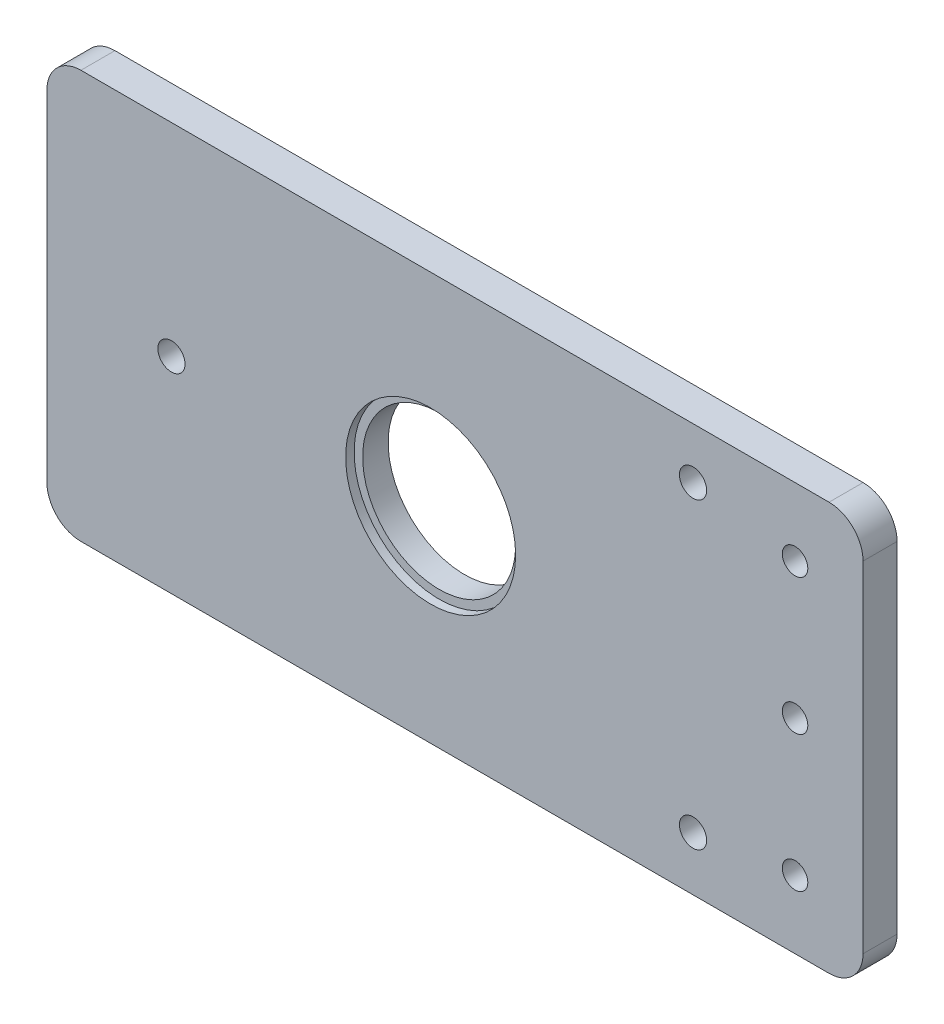
ISO-10303-21;
HEADER;
FILE_DESCRIPTION(('STEP AP214'),'2;1');
FILE_NAME('part.step','',(''),(''),'','','');
FILE_SCHEMA(('AUTOMOTIVE_DESIGN { 1 0 10303 214 1 1 1 1 }'));
ENDSEC;
DATA;
#1=APPLICATION_CONTEXT('core data for automotive mechanical design processes');
#2=APPLICATION_PROTOCOL_DEFINITION('international standard','automotive_design',2000,#1);
#3=PRODUCT_CONTEXT('',#1,'mechanical');
#4=PRODUCT('Part','Part','',(#3));
#5=PRODUCT_RELATED_PRODUCT_CATEGORY('part','',(#4));
#6=PRODUCT_DEFINITION_FORMATION('','',#4);
#7=PRODUCT_DEFINITION_CONTEXT('part definition',#1,'design');
#8=PRODUCT_DEFINITION('design','',#6,#7);
#9=PRODUCT_DEFINITION_SHAPE('','',#8);
#10=(LENGTH_UNIT() NAMED_UNIT(*) SI_UNIT(.MILLI.,.METRE.));
#11=(NAMED_UNIT(*) PLANE_ANGLE_UNIT() SI_UNIT($,.RADIAN.));
#12=(NAMED_UNIT(*) SI_UNIT($,.STERADIAN.) SOLID_ANGLE_UNIT());
#13=UNCERTAINTY_MEASURE_WITH_UNIT(LENGTH_MEASURE(1.E-05),#10,'distance_accuracy_value','');
#14=(GEOMETRIC_REPRESENTATION_CONTEXT(3) GLOBAL_UNCERTAINTY_ASSIGNED_CONTEXT((#13)) GLOBAL_UNIT_ASSIGNED_CONTEXT((#10,
#11,#12)) REPRESENTATION_CONTEXT('',''));
#15=CARTESIAN_POINT('',(0.,0.,0.));
#16=DIRECTION('',(0.,0.,1.));
#17=DIRECTION('',(1.,0.,0.));
#18=AXIS2_PLACEMENT_3D('',#15,#16,#17);
#19=CARTESIAN_POINT('',(-4.55000004400001,0.284999937999998,6.35));
#20=DIRECTION('',(0.,0.,-1.));
#21=DIRECTION('',(-1.,0.,0.));
#22=AXIS2_PLACEMENT_3D('',#19,#20,#21);
#23=CYLINDRICAL_SURFACE('',#22,14.2875);
#24=CARTESIAN_POINT('',(-4.55000004400001,0.284999937999998,0.));
#25=DIRECTION('',(0.,0.,1.));
#26=DIRECTION('',(1.,0.,0.));
#27=AXIS2_PLACEMENT_3D('',#24,#25,#26);
#28=CIRCLE('',#27,14.2875);
#29=CARTESIAN_POINT('',(9.73749995599999,0.284999937999998,0.));
#30=VERTEX_POINT('',#29);
#31=EDGE_CURVE('E210',#30,#30,#28,.T.);
#32=ORIENTED_EDGE('',*,*,#31,.F.);
#33=EDGE_LOOP('',(#32));
#34=FACE_BOUND('',#33,.T.);
#35=CARTESIAN_POINT('',(-4.55000004400001,0.284999937999998,4.7625));
#36=DIRECTION('',(0.,0.,1.));
#37=DIRECTION('',(1.,0.,0.));
#38=AXIS2_PLACEMENT_3D('',#35,#36,#37);
#39=CIRCLE('',#38,14.2875);
#40=CARTESIAN_POINT('',(9.73749995599999,0.284999937999998,4.7625));
#41=VERTEX_POINT('',#40);
#42=EDGE_CURVE('E35',#41,#41,#39,.T.);
#43=ORIENTED_EDGE('',*,*,#42,.T.);
#44=EDGE_LOOP('',(#43));
#45=FACE_BOUND('',#44,.T.);
#46=ADVANCED_FACE('F31',(#34,#45),#23,.F.);
#47=CARTESIAN_POINT('',(76.1999999999999,38.1,6.35));
#48=DIRECTION('',(0.,0.,-1.));
#49=DIRECTION('',(-1.,0.,0.));
#50=AXIS2_PLACEMENT_3D('',#47,#48,#49);
#51=PLANE('',#50);
#52=CARTESIAN_POINT('',(-4.55000004400001,0.284999937999998,6.35));
#53=DIRECTION('',(0.,0.,1.));
#54=DIRECTION('',(1.,0.,0.));
#55=AXIS2_PLACEMENT_3D('',#52,#53,#54);
#56=CIRCLE('',#55,15.875);
#57=CARTESIAN_POINT('',(11.324999956,0.284999937999998,6.35));
#58=VERTEX_POINT('',#57);
#59=EDGE_CURVE('E221',#58,#58,#56,.T.);
#60=ORIENTED_EDGE('',*,*,#59,.F.);
#61=EDGE_LOOP('',(#60));
#62=FACE_BOUND('',#61,.T.);
#63=CARTESIAN_POINT('',(63.5,0.,6.35));
#64=DIRECTION('',(0.,0.,1.));
#65=DIRECTION('',(1.,0.,0.));
#66=AXIS2_PLACEMENT_3D('',#63,#64,#65);
#67=CIRCLE('',#66,2.38125000000001);
#68=CARTESIAN_POINT('',(65.88125,0.,6.35));
#69=VERTEX_POINT('',#68);
#70=EDGE_CURVE('E198',#69,#69,#67,.T.);
#71=ORIENTED_EDGE('',*,*,#70,.F.);
#72=EDGE_LOOP('',(#71));
#73=FACE_BOUND('',#72,.T.);
#74=CARTESIAN_POINT('',(44.45,-28.022317844,6.35));
#75=DIRECTION('',(0.,0.,1.));
#76=DIRECTION('',(1.,0.,0.));
#77=AXIS2_PLACEMENT_3D('',#74,#75,#76);
#78=CIRCLE('',#77,2.54);
#79=CARTESIAN_POINT('',(46.99,-28.022317844,6.35));
#80=VERTEX_POINT('',#79);
#81=EDGE_CURVE('E187',#80,#80,#78,.T.);
#82=ORIENTED_EDGE('',*,*,#81,.F.);
#83=EDGE_LOOP('',(#82));
#84=FACE_BOUND('',#83,.T.);
#85=DIRECTION('',(1.,0.,0.));
#86=VECTOR('',#85,1.);
#87=CARTESIAN_POINT('',(-76.2,-38.1,6.35));
#88=LINE('',#87,#86);
#89=CARTESIAN_POINT('',(-69.85,-38.1,6.35));
#90=VERTEX_POINT('',#89);
#91=CARTESIAN_POINT('',(69.8499999999999,-38.1,6.35));
#92=VERTEX_POINT('',#91);
#93=EDGE_CURVE('E137',#90,#92,#88,.T.);
#94=ORIENTED_EDGE('',*,*,#93,.T.);
#95=CARTESIAN_POINT('',(69.85,-31.75,6.35));
#96=DIRECTION('',(0.,0.,-1.));
#97=DIRECTION('',(-1.,0.,0.));
#98=AXIS2_PLACEMENT_3D('',#95,#96,#97);
#99=CIRCLE('',#98,6.35);
#100=CARTESIAN_POINT('',(76.2,-31.75,6.35));
#101=VERTEX_POINT('',#100);
#102=EDGE_CURVE('E155',#92,#101,#99,.F.);
#103=ORIENTED_EDGE('',*,*,#102,.T.);
#104=DIRECTION('',(0.,1.,0.));
#105=VECTOR('',#104,1.);
#106=CARTESIAN_POINT('',(76.2,-38.1,6.35));
#107=LINE('',#106,#105);
#108=CARTESIAN_POINT('',(76.2,31.75,6.35));
#109=VERTEX_POINT('',#108);
#110=EDGE_CURVE('E119',#101,#109,#107,.T.);
#111=ORIENTED_EDGE('',*,*,#110,.T.);
#112=CARTESIAN_POINT('',(69.85,31.75,6.35));
#113=DIRECTION('',(0.,0.,-1.));
#114=DIRECTION('',(-1.,0.,0.));
#115=AXIS2_PLACEMENT_3D('',#112,#113,#114);
#116=CIRCLE('',#115,6.35);
#117=CARTESIAN_POINT('',(69.8499999999999,38.1,6.35));
#118=VERTEX_POINT('',#117);
#119=EDGE_CURVE('E151',#109,#118,#116,.F.);
#120=ORIENTED_EDGE('',*,*,#119,.T.);
#121=DIRECTION('',(-1.,0.,0.));
#122=VECTOR('',#121,1.);
#123=CARTESIAN_POINT('',(-76.2,38.1,6.35));
#124=LINE('',#123,#122);
#125=CARTESIAN_POINT('',(-69.85,38.1,6.35));
#126=VERTEX_POINT('',#125);
#127=EDGE_CURVE('E165',#118,#126,#124,.T.);
#128=ORIENTED_EDGE('',*,*,#127,.T.);
#129=CARTESIAN_POINT('',(-69.85,31.75,6.35));
#130=DIRECTION('',(0.,0.,-1.));
#131=DIRECTION('',(-1.,0.,0.));
#132=AXIS2_PLACEMENT_3D('',#129,#130,#131);
#133=CIRCLE('',#132,6.35);
#134=CARTESIAN_POINT('',(-76.2,31.75,6.35));
#135=VERTEX_POINT('',#134);
#136=EDGE_CURVE('E54',#126,#135,#133,.F.);
#137=ORIENTED_EDGE('',*,*,#136,.T.);
#138=DIRECTION('',(0.,-1.,0.));
#139=VECTOR('',#138,1.);
#140=CARTESIAN_POINT('',(-76.2,-38.1,6.35));
#141=LINE('',#140,#139);
#142=CARTESIAN_POINT('',(-76.2,-31.75,6.35));
#143=VERTEX_POINT('',#142);
#144=EDGE_CURVE('E172',#135,#143,#141,.T.);
#145=ORIENTED_EDGE('',*,*,#144,.T.);
#146=CARTESIAN_POINT('',(-69.85,-31.75,6.35));
#147=DIRECTION('',(0.,0.,-1.));
#148=DIRECTION('',(-1.,0.,0.));
#149=AXIS2_PLACEMENT_3D('',#146,#147,#148);
#150=CIRCLE('',#149,6.35);
#151=EDGE_CURVE('E153',#143,#90,#150,.F.);
#152=ORIENTED_EDGE('',*,*,#151,.T.);
#153=EDGE_LOOP('',(#94,#103,#111,#120,#128,#137,#145,#152));
#154=FACE_BOUND('',#153,.T.);
#155=CARTESIAN_POINT('',(44.45,28.575,6.35));
#156=DIRECTION('',(0.,0.,1.));
#157=DIRECTION('',(1.,0.,0.));
#158=AXIS2_PLACEMENT_3D('',#155,#156,#157);
#159=CIRCLE('',#158,2.54);
#160=CARTESIAN_POINT('',(46.99,28.575,6.35));
#161=VERTEX_POINT('',#160);
#162=EDGE_CURVE('E128',#161,#161,#159,.T.);
#163=ORIENTED_EDGE('',*,*,#162,.F.);
#164=EDGE_LOOP('',(#163));
#165=FACE_BOUND('',#164,.T.);
#166=CARTESIAN_POINT('',(63.5,25.4,6.35));
#167=DIRECTION('',(0.,0.,1.));
#168=DIRECTION('',(1.,0.,0.));
#169=AXIS2_PLACEMENT_3D('',#166,#167,#168);
#170=CIRCLE('',#169,2.38125000000001);
#171=CARTESIAN_POINT('',(65.88125,25.4,6.35));
#172=VERTEX_POINT('',#171);
#173=EDGE_CURVE('E192',#172,#172,#170,.T.);
#174=ORIENTED_EDGE('',*,*,#173,.F.);
#175=EDGE_LOOP('',(#174));
#176=FACE_BOUND('',#175,.T.);
#177=CARTESIAN_POINT('',(63.5,-25.4,6.35));
#178=DIRECTION('',(0.,0.,1.));
#179=DIRECTION('',(1.,0.,0.));
#180=AXIS2_PLACEMENT_3D('',#177,#178,#179);
#181=CIRCLE('',#180,2.38125000000001);
#182=CARTESIAN_POINT('',(65.88125,-25.4,6.35));
#183=VERTEX_POINT('',#182);
#184=EDGE_CURVE('E204',#183,#183,#181,.T.);
#185=ORIENTED_EDGE('',*,*,#184,.F.);
#186=EDGE_LOOP('',(#185));
#187=FACE_BOUND('',#186,.T.);
#188=CARTESIAN_POINT('',(-52.950000018,0.284999937999998,6.35));
#189=DIRECTION('',(0.,0.,1.));
#190=DIRECTION('',(1.,0.,0.));
#191=AXIS2_PLACEMENT_3D('',#188,#189,#190);
#192=CIRCLE('',#191,2.54);
#193=CARTESIAN_POINT('',(-50.410000018,0.284999937999998,6.35));
#194=VERTEX_POINT('',#193);
#195=EDGE_CURVE('E215',#194,#194,#192,.T.);
#196=ORIENTED_EDGE('',*,*,#195,.F.);
#197=EDGE_LOOP('',(#196));
#198=FACE_BOUND('',#197,.T.);
#199=ADVANCED_FACE('F169',(#62,#73,#84,#154,#165,#176,#187,#198),#51,.F.);
#200=CARTESIAN_POINT('',(76.1999999999999,38.1,0.));
#201=DIRECTION('',(0.,0.,-1.));
#202=DIRECTION('',(-1.,0.,0.));
#203=AXIS2_PLACEMENT_3D('',#200,#201,#202);
#204=PLANE('',#203);
#205=ORIENTED_EDGE('',*,*,#31,.T.);
#206=EDGE_LOOP('',(#205));
#207=FACE_BOUND('',#206,.T.);
#208=CARTESIAN_POINT('',(63.5,0.,0.));
#209=DIRECTION('',(0.,0.,1.));
#210=DIRECTION('',(1.,0.,0.));
#211=AXIS2_PLACEMENT_3D('',#208,#209,#210);
#212=CIRCLE('',#211,2.38125000000001);
#213=CARTESIAN_POINT('',(65.88125,0.,0.));
#214=VERTEX_POINT('',#213);
#215=EDGE_CURVE('E201',#214,#214,#212,.T.);
#216=ORIENTED_EDGE('',*,*,#215,.T.);
#217=EDGE_LOOP('',(#216));
#218=FACE_BOUND('',#217,.T.);
#219=CARTESIAN_POINT('',(44.45,-28.022317844,0.));
#220=DIRECTION('',(0.,0.,1.));
#221=DIRECTION('',(1.,0.,0.));
#222=AXIS2_PLACEMENT_3D('',#219,#220,#221);
#223=CIRCLE('',#222,2.54);
#224=CARTESIAN_POINT('',(46.99,-28.022317844,0.));
#225=VERTEX_POINT('',#224);
#226=EDGE_CURVE('E189',#225,#225,#223,.T.);
#227=ORIENTED_EDGE('',*,*,#226,.T.);
#228=EDGE_LOOP('',(#227));
#229=FACE_BOUND('',#228,.T.);
#230=DIRECTION('',(0.,1.,0.));
#231=VECTOR('',#230,1.);
#232=CARTESIAN_POINT('',(76.2,-38.1,0.));
#233=LINE('',#232,#231);
#234=CARTESIAN_POINT('',(76.2,-31.75,0.));
#235=VERTEX_POINT('',#234);
#236=CARTESIAN_POINT('',(76.2,31.75,0.));
#237=VERTEX_POINT('',#236);
#238=EDGE_CURVE('E116',#235,#237,#233,.T.);
#239=ORIENTED_EDGE('',*,*,#238,.F.);
#240=CARTESIAN_POINT('',(69.85,-31.75,0.));
#241=DIRECTION('',(0.,0.,-1.));
#242=DIRECTION('',(-1.,0.,0.));
#243=AXIS2_PLACEMENT_3D('',#240,#241,#242);
#244=CIRCLE('',#243,6.35);
#245=CARTESIAN_POINT('',(69.8499999999999,-38.1,0.));
#246=VERTEX_POINT('',#245);
#247=EDGE_CURVE('E99',#235,#246,#244,.T.);
#248=ORIENTED_EDGE('',*,*,#247,.T.);
#249=DIRECTION('',(1.,0.,0.));
#250=VECTOR('',#249,1.);
#251=CARTESIAN_POINT('',(-76.2,-38.1,0.));
#252=LINE('',#251,#250);
#253=CARTESIAN_POINT('',(-69.85,-38.1,0.));
#254=VERTEX_POINT('',#253);
#255=EDGE_CURVE('E141',#254,#246,#252,.T.);
#256=ORIENTED_EDGE('',*,*,#255,.F.);
#257=CARTESIAN_POINT('',(-69.85,-31.75,0.));
#258=DIRECTION('',(0.,0.,-1.));
#259=DIRECTION('',(-1.,0.,0.));
#260=AXIS2_PLACEMENT_3D('',#257,#258,#259);
#261=CIRCLE('',#260,6.35);
#262=CARTESIAN_POINT('',(-76.2,-31.75,0.));
#263=VERTEX_POINT('',#262);
#264=EDGE_CURVE('E110',#254,#263,#261,.T.);
#265=ORIENTED_EDGE('',*,*,#264,.T.);
#266=DIRECTION('',(0.,-1.,0.));
#267=VECTOR('',#266,1.);
#268=CARTESIAN_POINT('',(-76.2,-38.1,0.));
#269=LINE('',#268,#267);
#270=CARTESIAN_POINT('',(-76.2,31.75,0.));
#271=VERTEX_POINT('',#270);
#272=EDGE_CURVE('E131',#271,#263,#269,.T.);
#273=ORIENTED_EDGE('',*,*,#272,.F.);
#274=CARTESIAN_POINT('',(-69.85,31.75,0.));
#275=DIRECTION('',(0.,0.,-1.));
#276=DIRECTION('',(-1.,0.,0.));
#277=AXIS2_PLACEMENT_3D('',#274,#275,#276);
#278=CIRCLE('',#277,6.35);
#279=CARTESIAN_POINT('',(-69.85,38.1,0.));
#280=VERTEX_POINT('',#279);
#281=EDGE_CURVE('E120',#271,#280,#278,.T.);
#282=ORIENTED_EDGE('',*,*,#281,.T.);
#283=DIRECTION('',(-1.,0.,0.));
#284=VECTOR('',#283,1.);
#285=CARTESIAN_POINT('',(-76.2,38.1,0.));
#286=LINE('',#285,#284);
#287=CARTESIAN_POINT('',(69.8499999999999,38.1,0.));
#288=VERTEX_POINT('',#287);
#289=EDGE_CURVE('E127',#288,#280,#286,.T.);
#290=ORIENTED_EDGE('',*,*,#289,.F.);
#291=CARTESIAN_POINT('',(69.85,31.75,0.));
#292=DIRECTION('',(0.,0.,-1.));
#293=DIRECTION('',(-1.,0.,0.));
#294=AXIS2_PLACEMENT_3D('',#291,#292,#293);
#295=CIRCLE('',#294,6.35);
#296=EDGE_CURVE('E126',#288,#237,#295,.T.);
#297=ORIENTED_EDGE('',*,*,#296,.T.);
#298=EDGE_LOOP('',(#239,#248,#256,#265,#273,#282,#290,#297));
#299=FACE_BOUND('',#298,.T.);
#300=CARTESIAN_POINT('',(44.45,28.575,0.));
#301=DIRECTION('',(0.,0.,1.));
#302=DIRECTION('',(1.,0.,0.));
#303=AXIS2_PLACEMENT_3D('',#300,#301,#302);
#304=CIRCLE('',#303,2.54);
#305=CARTESIAN_POINT('',(46.99,28.575,0.));
#306=VERTEX_POINT('',#305);
#307=EDGE_CURVE('E134',#306,#306,#304,.T.);
#308=ORIENTED_EDGE('',*,*,#307,.T.);
#309=EDGE_LOOP('',(#308));
#310=FACE_BOUND('',#309,.T.);
#311=CARTESIAN_POINT('',(63.5,25.4,0.));
#312=DIRECTION('',(0.,0.,1.));
#313=DIRECTION('',(1.,0.,0.));
#314=AXIS2_PLACEMENT_3D('',#311,#312,#313);
#315=CIRCLE('',#314,2.38125000000001);
#316=CARTESIAN_POINT('',(65.88125,25.4,0.));
#317=VERTEX_POINT('',#316);
#318=EDGE_CURVE('E195',#317,#317,#315,.T.);
#319=ORIENTED_EDGE('',*,*,#318,.T.);
#320=EDGE_LOOP('',(#319));
#321=FACE_BOUND('',#320,.T.);
#322=CARTESIAN_POINT('',(63.5,-25.4,0.));
#323=DIRECTION('',(0.,0.,1.));
#324=DIRECTION('',(1.,0.,0.));
#325=AXIS2_PLACEMENT_3D('',#322,#323,#324);
#326=CIRCLE('',#325,2.38125000000001);
#327=CARTESIAN_POINT('',(65.88125,-25.4,0.));
#328=VERTEX_POINT('',#327);
#329=EDGE_CURVE('E207',#328,#328,#326,.T.);
#330=ORIENTED_EDGE('',*,*,#329,.T.);
#331=EDGE_LOOP('',(#330));
#332=FACE_BOUND('',#331,.T.);
#333=CARTESIAN_POINT('',(-52.950000018,0.284999937999998,0.));
#334=DIRECTION('',(0.,0.,1.));
#335=DIRECTION('',(1.,0.,0.));
#336=AXIS2_PLACEMENT_3D('',#333,#334,#335);
#337=CIRCLE('',#336,2.54);
#338=CARTESIAN_POINT('',(-50.410000018,0.284999937999998,0.));
#339=VERTEX_POINT('',#338);
#340=EDGE_CURVE('E216',#339,#339,#337,.T.);
#341=ORIENTED_EDGE('',*,*,#340,.T.);
#342=EDGE_LOOP('',(#341));
#343=FACE_BOUND('',#342,.T.);
#344=ADVANCED_FACE('F123',(#207,#218,#229,#299,#310,#321,#332,#343),#204,.T.);
#345=CARTESIAN_POINT('',(76.2,-38.1,6.35));
#346=DIRECTION('',(-1.,0.,0.));
#347=DIRECTION('',(0.,0.,1.));
#348=AXIS2_PLACEMENT_3D('',#345,#346,#347);
#349=PLANE('',#348);
#350=ORIENTED_EDGE('',*,*,#110,.F.);
#351=DIRECTION('',(0.,0.,-1.));
#352=VECTOR('',#351,1.);
#353=CARTESIAN_POINT('',(76.2,-31.75,6.35));
#354=LINE('',#353,#352);
#355=EDGE_CURVE('E103',#101,#235,#354,.T.);
#356=ORIENTED_EDGE('',*,*,#355,.T.);
#357=ORIENTED_EDGE('',*,*,#238,.T.);
#358=DIRECTION('',(0.,0.,-1.));
#359=VECTOR('',#358,1.);
#360=CARTESIAN_POINT('',(76.2,31.75,6.35));
#361=LINE('',#360,#359);
#362=EDGE_CURVE('E121',#237,#109,#361,.F.);
#363=ORIENTED_EDGE('',*,*,#362,.T.);
#364=EDGE_LOOP('',(#350,#356,#357,#363));
#365=FACE_BOUND('',#364,.T.);
#366=ADVANCED_FACE('F115',(#365),#349,.F.);
#367=CARTESIAN_POINT('',(-76.2,38.1,6.35));
#368=DIRECTION('',(0.,-1.,0.));
#369=DIRECTION('',(0.,0.,-1.));
#370=AXIS2_PLACEMENT_3D('',#367,#368,#369);
#371=PLANE('',#370);
#372=ORIENTED_EDGE('',*,*,#127,.F.);
#373=DIRECTION('',(0.,0.,-1.));
#374=VECTOR('',#373,1.);
#375=CARTESIAN_POINT('',(69.85,38.1,6.35));
#376=LINE('',#375,#374);
#377=EDGE_CURVE('E11',#118,#288,#376,.T.);
#378=ORIENTED_EDGE('',*,*,#377,.T.);
#379=ORIENTED_EDGE('',*,*,#289,.T.);
#380=DIRECTION('',(0.,0.,-1.));
#381=VECTOR('',#380,1.);
#382=CARTESIAN_POINT('',(-69.85,38.1,6.35));
#383=LINE('',#382,#381);
#384=EDGE_CURVE('E40',#280,#126,#383,.F.);
#385=ORIENTED_EDGE('',*,*,#384,.T.);
#386=EDGE_LOOP('',(#372,#378,#379,#385));
#387=FACE_BOUND('',#386,.T.);
#388=ADVANCED_FACE('F164',(#387),#371,.F.);
#389=CARTESIAN_POINT('',(-76.2,-38.1,6.35));
#390=DIRECTION('',(1.,0.,0.));
#391=DIRECTION('',(0.,0.,-1.));
#392=AXIS2_PLACEMENT_3D('',#389,#390,#391);
#393=PLANE('',#392);
#394=ORIENTED_EDGE('',*,*,#272,.T.);
#395=DIRECTION('',(0.,0.,-1.));
#396=VECTOR('',#395,1.);
#397=CARTESIAN_POINT('',(-76.2,-31.75,6.35));
#398=LINE('',#397,#396);
#399=EDGE_CURVE('E47',#263,#143,#398,.F.);
#400=ORIENTED_EDGE('',*,*,#399,.T.);
#401=ORIENTED_EDGE('',*,*,#144,.F.);
#402=DIRECTION('',(0.,0.,-1.));
#403=VECTOR('',#402,1.);
#404=CARTESIAN_POINT('',(-76.2,31.75,6.35));
#405=LINE('',#404,#403);
#406=EDGE_CURVE('E157',#135,#271,#405,.T.);
#407=ORIENTED_EDGE('',*,*,#406,.T.);
#408=EDGE_LOOP('',(#394,#400,#401,#407));
#409=FACE_BOUND('',#408,.T.);
#410=ADVANCED_FACE('F176',(#409),#393,.F.);
#411=CARTESIAN_POINT('',(-76.2,-38.1,6.35));
#412=DIRECTION('',(0.,1.,0.));
#413=DIRECTION('',(0.,0.,1.));
#414=AXIS2_PLACEMENT_3D('',#411,#412,#413);
#415=PLANE('',#414);
#416=ORIENTED_EDGE('',*,*,#255,.T.);
#417=DIRECTION('',(0.,0.,-1.));
#418=VECTOR('',#417,1.);
#419=CARTESIAN_POINT('',(69.85,-38.1,6.35));
#420=LINE('',#419,#418);
#421=EDGE_CURVE('E104',#246,#92,#420,.F.);
#422=ORIENTED_EDGE('',*,*,#421,.T.);
#423=ORIENTED_EDGE('',*,*,#93,.F.);
#424=DIRECTION('',(0.,0.,-1.));
#425=VECTOR('',#424,1.);
#426=CARTESIAN_POINT('',(-69.85,-38.1,6.35));
#427=LINE('',#426,#425);
#428=EDGE_CURVE('E109',#90,#254,#427,.T.);
#429=ORIENTED_EDGE('',*,*,#428,.T.);
#430=EDGE_LOOP('',(#416,#422,#423,#429));
#431=FACE_BOUND('',#430,.T.);
#432=ADVANCED_FACE('F183',(#431),#415,.F.);
#433=CARTESIAN_POINT('',(44.45,28.575,6.35));
#434=DIRECTION('',(0.,0.,-1.));
#435=DIRECTION('',(-1.,0.,0.));
#436=AXIS2_PLACEMENT_3D('',#433,#434,#435);
#437=CYLINDRICAL_SURFACE('',#436,2.54);
#438=ORIENTED_EDGE('',*,*,#162,.T.);
#439=EDGE_LOOP('',(#438));
#440=FACE_BOUND('',#439,.T.);
#441=ORIENTED_EDGE('',*,*,#307,.F.);
#442=EDGE_LOOP('',(#441));
#443=FACE_BOUND('',#442,.T.);
#444=ADVANCED_FACE('F268',(#440,#443),#437,.F.);
#445=CARTESIAN_POINT('',(44.45,-28.022317844,6.35));
#446=DIRECTION('',(0.,0.,-1.));
#447=DIRECTION('',(-1.,0.,0.));
#448=AXIS2_PLACEMENT_3D('',#445,#446,#447);
#449=CYLINDRICAL_SURFACE('',#448,2.54);
#450=ORIENTED_EDGE('',*,*,#81,.T.);
#451=EDGE_LOOP('',(#450));
#452=FACE_BOUND('',#451,.T.);
#453=ORIENTED_EDGE('',*,*,#226,.F.);
#454=EDGE_LOOP('',(#453));
#455=FACE_BOUND('',#454,.T.);
#456=ADVANCED_FACE('F264',(#452,#455),#449,.F.);
#457=CARTESIAN_POINT('',(63.5,25.4,6.35));
#458=DIRECTION('',(0.,0.,-1.));
#459=DIRECTION('',(-1.,0.,0.));
#460=AXIS2_PLACEMENT_3D('',#457,#458,#459);
#461=CYLINDRICAL_SURFACE('',#460,2.38125000000001);
#462=ORIENTED_EDGE('',*,*,#173,.T.);
#463=EDGE_LOOP('',(#462));
#464=FACE_BOUND('',#463,.T.);
#465=ORIENTED_EDGE('',*,*,#318,.F.);
#466=EDGE_LOOP('',(#465));
#467=FACE_BOUND('',#466,.T.);
#468=ADVANCED_FACE('F260',(#464,#467),#461,.F.);
#469=CARTESIAN_POINT('',(63.5,0.,6.35));
#470=DIRECTION('',(0.,0.,-1.));
#471=DIRECTION('',(-1.,0.,0.));
#472=AXIS2_PLACEMENT_3D('',#469,#470,#471);
#473=CYLINDRICAL_SURFACE('',#472,2.38125000000001);
#474=ORIENTED_EDGE('',*,*,#70,.T.);
#475=EDGE_LOOP('',(#474));
#476=FACE_BOUND('',#475,.T.);
#477=ORIENTED_EDGE('',*,*,#215,.F.);
#478=EDGE_LOOP('',(#477));
#479=FACE_BOUND('',#478,.T.);
#480=ADVANCED_FACE('F256',(#476,#479),#473,.F.);
#481=CARTESIAN_POINT('',(63.5,-25.4,6.35));
#482=DIRECTION('',(0.,0.,-1.));
#483=DIRECTION('',(-1.,0.,0.));
#484=AXIS2_PLACEMENT_3D('',#481,#482,#483);
#485=CYLINDRICAL_SURFACE('',#484,2.38125000000001);
#486=ORIENTED_EDGE('',*,*,#184,.T.);
#487=EDGE_LOOP('',(#486));
#488=FACE_BOUND('',#487,.T.);
#489=ORIENTED_EDGE('',*,*,#329,.F.);
#490=EDGE_LOOP('',(#489));
#491=FACE_BOUND('',#490,.T.);
#492=ADVANCED_FACE('F253',(#488,#491),#485,.F.);
#493=CARTESIAN_POINT('',(-52.950000018,0.284999937999998,6.35));
#494=DIRECTION('',(0.,0.,-1.));
#495=DIRECTION('',(-1.,0.,0.));
#496=AXIS2_PLACEMENT_3D('',#493,#494,#495);
#497=CYLINDRICAL_SURFACE('',#496,2.54);
#498=ORIENTED_EDGE('',*,*,#195,.T.);
#499=EDGE_LOOP('',(#498));
#500=FACE_BOUND('',#499,.T.);
#501=ORIENTED_EDGE('',*,*,#340,.F.);
#502=EDGE_LOOP('',(#501));
#503=FACE_BOUND('',#502,.T.);
#504=ADVANCED_FACE('F252',(#500,#503),#497,.F.);
#505=CARTESIAN_POINT('',(69.85,-31.75,6.35));
#506=DIRECTION('',(0.,0.,-1.));
#507=DIRECTION('',(-1.,0.,0.));
#508=AXIS2_PLACEMENT_3D('',#505,#506,#507);
#509=CYLINDRICAL_SURFACE('',#508,6.35);
#510=ORIENTED_EDGE('',*,*,#102,.F.);
#511=ORIENTED_EDGE('',*,*,#421,.F.);
#512=ORIENTED_EDGE('',*,*,#247,.F.);
#513=ORIENTED_EDGE('',*,*,#355,.F.);
#514=EDGE_LOOP('',(#510,#511,#512,#513));
#515=FACE_BOUND('',#514,.T.);
#516=ADVANCED_FACE('F102',(#515),#509,.T.);
#517=CARTESIAN_POINT('',(-69.85,-31.75,6.35));
#518=DIRECTION('',(0.,0.,-1.));
#519=DIRECTION('',(-1.,0.,0.));
#520=AXIS2_PLACEMENT_3D('',#517,#518,#519);
#521=CYLINDRICAL_SURFACE('',#520,6.35);
#522=ORIENTED_EDGE('',*,*,#151,.F.);
#523=ORIENTED_EDGE('',*,*,#399,.F.);
#524=ORIENTED_EDGE('',*,*,#264,.F.);
#525=ORIENTED_EDGE('',*,*,#428,.F.);
#526=EDGE_LOOP('',(#522,#523,#524,#525));
#527=FACE_BOUND('',#526,.T.);
#528=ADVANCED_FACE('F180',(#527),#521,.T.);
#529=CARTESIAN_POINT('',(69.85,31.75,6.35));
#530=DIRECTION('',(0.,0.,-1.));
#531=DIRECTION('',(-1.,0.,0.));
#532=AXIS2_PLACEMENT_3D('',#529,#530,#531);
#533=CYLINDRICAL_SURFACE('',#532,6.35);
#534=ORIENTED_EDGE('',*,*,#119,.F.);
#535=ORIENTED_EDGE('',*,*,#362,.F.);
#536=ORIENTED_EDGE('',*,*,#296,.F.);
#537=ORIENTED_EDGE('',*,*,#377,.F.);
#538=EDGE_LOOP('',(#534,#535,#536,#537));
#539=FACE_BOUND('',#538,.T.);
#540=ADVANCED_FACE('F287',(#539),#533,.T.);
#541=CARTESIAN_POINT('',(-69.85,31.75,6.35));
#542=DIRECTION('',(0.,0.,-1.));
#543=DIRECTION('',(-1.,0.,0.));
#544=AXIS2_PLACEMENT_3D('',#541,#542,#543);
#545=CYLINDRICAL_SURFACE('',#544,6.35);
#546=ORIENTED_EDGE('',*,*,#136,.F.);
#547=ORIENTED_EDGE('',*,*,#384,.F.);
#548=ORIENTED_EDGE('',*,*,#281,.F.);
#549=ORIENTED_EDGE('',*,*,#406,.F.);
#550=EDGE_LOOP('',(#546,#547,#548,#549));
#551=FACE_BOUND('',#550,.T.);
#552=ADVANCED_FACE('F33',(#551),#545,.T.);
#553=CARTESIAN_POINT('',(-4.55000004400001,0.284999937999998,4.7625));
#554=DIRECTION('',(0.,0.,1.));
#555=DIRECTION('',(1.,0.,0.));
#556=AXIS2_PLACEMENT_3D('',#553,#554,#555);
#557=CYLINDRICAL_SURFACE('',#556,15.875);
#558=CARTESIAN_POINT('',(-4.55000004400001,0.284999937999998,4.7625));
#559=DIRECTION('',(0.,0.,1.));
#560=DIRECTION('',(1.,0.,0.));
#561=AXIS2_PLACEMENT_3D('',#558,#559,#560);
#562=CIRCLE('',#561,15.875);
#563=CARTESIAN_POINT('',(11.324999956,0.284999937999998,4.7625));
#564=VERTEX_POINT('',#563);
#565=EDGE_CURVE('E224',#564,#564,#562,.T.);
#566=ORIENTED_EDGE('',*,*,#565,.F.);
#567=EDGE_LOOP('',(#566));
#568=FACE_BOUND('',#567,.T.);
#569=ORIENTED_EDGE('',*,*,#59,.T.);
#570=EDGE_LOOP('',(#569));
#571=FACE_BOUND('',#570,.T.);
#572=ADVANCED_FACE('F234',(#568,#571),#557,.F.);
#573=CARTESIAN_POINT('',(-4.55000004400001,0.284999937999998,4.7625));
#574=DIRECTION('',(0.,0.,1.));
#575=DIRECTION('',(1.,0.,0.));
#576=AXIS2_PLACEMENT_3D('',#573,#574,#575);
#577=PLANE('',#576);
#578=ORIENTED_EDGE('',*,*,#42,.F.);
#579=EDGE_LOOP('',(#578));
#580=FACE_BOUND('',#579,.T.);
#581=ORIENTED_EDGE('',*,*,#565,.T.);
#582=EDGE_LOOP('',(#581));
#583=FACE_BOUND('',#582,.T.);
#584=ADVANCED_FACE('F232',(#580,#583),#577,.T.);
#585=CLOSED_SHELL('',(#46,#199,#344,#366,#388,#410,#432,#444,#456,#468,#480,#492,#504,#516,#528,
#540,#552,#572,#584));
#586=MANIFOLD_SOLID_BREP('B2',#585);
#587=ADVANCED_BREP_SHAPE_REPRESENTATION('',(#18,#586),#14);
#588=SHAPE_DEFINITION_REPRESENTATION(#9,#587);
ENDSEC;
END-ISO-10303-21;
